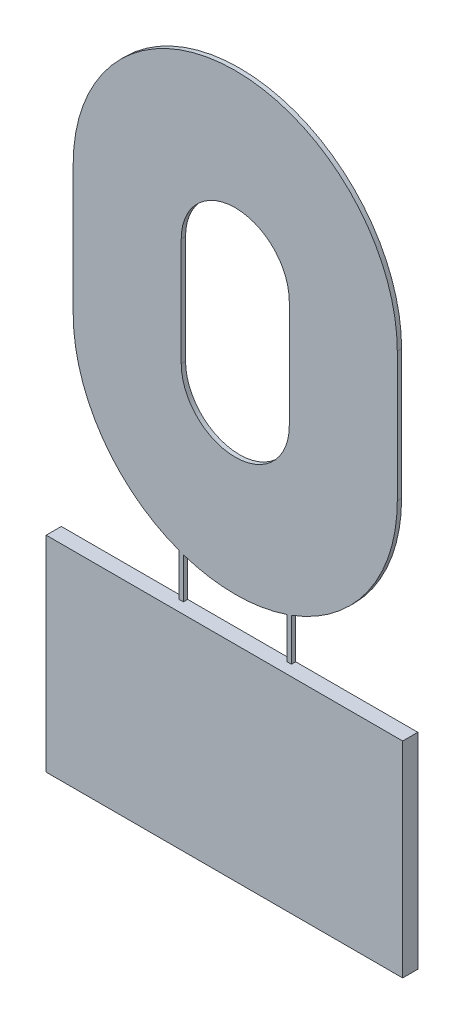
ISO-10303-21;
HEADER;
FILE_DESCRIPTION(('STEP AP214'),'2;1');
FILE_NAME('part.step','',(''),(''),'','','');
FILE_SCHEMA(('AUTOMOTIVE_DESIGN { 1 0 10303 214 1 1 1 1 }'));
ENDSEC;
DATA;
#1=APPLICATION_CONTEXT('core data for automotive mechanical design processes');
#2=APPLICATION_PROTOCOL_DEFINITION('international standard','automotive_design',2000,#1);
#3=PRODUCT_CONTEXT('',#1,'mechanical');
#4=PRODUCT('Part','Part','',(#3));
#5=PRODUCT_RELATED_PRODUCT_CATEGORY('part','',(#4));
#6=PRODUCT_DEFINITION_FORMATION('','',#4);
#7=PRODUCT_DEFINITION_CONTEXT('part definition',#1,'design');
#8=PRODUCT_DEFINITION('design','',#6,#7);
#9=PRODUCT_DEFINITION_SHAPE('','',#8);
#10=(LENGTH_UNIT() NAMED_UNIT(*) SI_UNIT(.MILLI.,.METRE.));
#11=(NAMED_UNIT(*) PLANE_ANGLE_UNIT() SI_UNIT($,.RADIAN.));
#12=(NAMED_UNIT(*) SI_UNIT($,.STERADIAN.) SOLID_ANGLE_UNIT());
#13=UNCERTAINTY_MEASURE_WITH_UNIT(LENGTH_MEASURE(1.E-05),#10,'distance_accuracy_value','');
#14=(GEOMETRIC_REPRESENTATION_CONTEXT(3) GLOBAL_UNCERTAINTY_ASSIGNED_CONTEXT((#13)) GLOBAL_UNIT_ASSIGNED_CONTEXT((#10,
#11,#12)) REPRESENTATION_CONTEXT('',''));
#15=CARTESIAN_POINT('',(0.,0.,0.));
#16=DIRECTION('',(0.,0.,1.));
#17=DIRECTION('',(1.,0.,0.));
#18=AXIS2_PLACEMENT_3D('',#15,#16,#17);
#19=CARTESIAN_POINT('',(0.,-6.,0.4));
#20=DIRECTION('',(0.,0.,-1.));
#21=DIRECTION('',(-1.,0.,0.));
#22=AXIS2_PLACEMENT_3D('',#19,#20,#21);
#23=CYLINDRICAL_SURFACE('',#22,15.);
#24=CARTESIAN_POINT('',(0.,-6.,0.4));
#25=DIRECTION('',(0.,0.,1.));
#26=DIRECTION('',(1.,0.,0.));
#27=AXIS2_PLACEMENT_3D('',#24,#25,#26);
#28=CIRCLE('',#27,15.);
#29=CARTESIAN_POINT('',(-4.79999999999998,-20.2112631387924,0.4));
#30=VERTEX_POINT('',#29);
#31=CARTESIAN_POINT('',(4.80000000000001,-20.2112631387924,0.4));
#32=VERTEX_POINT('',#31);
#33=EDGE_CURVE('E397',#30,#32,#28,.T.);
#34=ORIENTED_EDGE('',*,*,#33,.F.);
#35=DIRECTION('',(0.,0.,-1.));
#36=VECTOR('',#35,1.);
#37=CARTESIAN_POINT('',(-4.79999999999998,-20.2112631387924,0.4));
#38=LINE('',#37,#36);
#39=CARTESIAN_POINT('',(-4.79999999999998,-20.2112631387924,0.));
#40=VERTEX_POINT('',#39);
#41=EDGE_CURVE('E269',#30,#40,#38,.T.);
#42=ORIENTED_EDGE('',*,*,#41,.T.);
#43=CARTESIAN_POINT('',(0.,-6.,0.));
#44=DIRECTION('',(0.,0.,1.));
#45=DIRECTION('',(1.,0.,0.));
#46=AXIS2_PLACEMENT_3D('',#43,#44,#45);
#47=CIRCLE('',#46,15.);
#48=CARTESIAN_POINT('',(4.80000000000001,-20.2112631387924,0.));
#49=VERTEX_POINT('',#48);
#50=EDGE_CURVE('E408',#40,#49,#47,.T.);
#51=ORIENTED_EDGE('',*,*,#50,.T.);
#52=DIRECTION('',(0.,0.,-1.));
#53=VECTOR('',#52,1.);
#54=CARTESIAN_POINT('',(4.80000000000001,-20.2112631387924,0.4));
#55=LINE('',#54,#53);
#56=EDGE_CURVE('E421',#49,#32,#55,.F.);
#57=ORIENTED_EDGE('',*,*,#56,.T.);
#58=EDGE_LOOP('',(#34,#42,#51,#57));
#59=FACE_BOUND('',#58,.T.);
#60=ADVANCED_FACE('F38',(#59),#23,.T.);
#61=CARTESIAN_POINT('',(0.,6.,0.4));
#62=DIRECTION('',(0.,0.,1.));
#63=DIRECTION('',(1.,0.,0.));
#64=AXIS2_PLACEMENT_3D('',#61,#62,#63);
#65=PLANE('',#64);
#66=CARTESIAN_POINT('',(-15.,-6.,0.4));
#67=VERTEX_POINT('',#66);
#68=CARTESIAN_POINT('',(-5.19999999999998,-20.0698258695693,0.4));
#69=VERTEX_POINT('',#68);
#70=EDGE_CURVE('E393',#67,#69,#28,.T.);
#71=ORIENTED_EDGE('',*,*,#70,.T.);
#72=DIRECTION('',(0.,-1.,0.));
#73=VECTOR('',#72,1.);
#74=CARTESIAN_POINT('',(-5.19999999999998,-18.2212359899984,0.4));
#75=LINE('',#74,#73);
#76=CARTESIAN_POINT('',(-5.19999999999998,-24.,0.4));
#77=VERTEX_POINT('',#76);
#78=EDGE_CURVE('E246',#69,#77,#75,.T.);
#79=ORIENTED_EDGE('',*,*,#78,.T.);
#80=DIRECTION('',(-1.,0.,0.));
#81=VECTOR('',#80,1.);
#82=CARTESIAN_POINT('',(-16.5,-24.,0.4));
#83=LINE('',#82,#81);
#84=CARTESIAN_POINT('',(-4.79999999999998,-24.,0.4));
#85=VERTEX_POINT('',#84);
#86=EDGE_CURVE('E46',#85,#77,#83,.T.);
#87=ORIENTED_EDGE('',*,*,#86,.F.);
#88=DIRECTION('',(0.,1.,0.));
#89=VECTOR('',#88,1.);
#90=CARTESIAN_POINT('',(-4.79999999999999,-18.2212359899984,0.4));
#91=LINE('',#90,#89);
#92=EDGE_CURVE('E53',#85,#30,#91,.T.);
#93=ORIENTED_EDGE('',*,*,#92,.T.);
#94=ORIENTED_EDGE('',*,*,#33,.T.);
#95=DIRECTION('',(0.,-1.,0.));
#96=VECTOR('',#95,1.);
#97=CARTESIAN_POINT('',(4.80000000000001,-18.2604078670592,0.4));
#98=LINE('',#97,#96);
#99=CARTESIAN_POINT('',(4.80000000000002,-24.,0.400000000000002));
#100=VERTEX_POINT('',#99);
#101=EDGE_CURVE('E320',#32,#100,#98,.T.);
#102=ORIENTED_EDGE('',*,*,#101,.T.);
#103=DIRECTION('',(1.,0.,0.));
#104=VECTOR('',#103,1.);
#105=CARTESIAN_POINT('',(0.,-24.,0.4));
#106=LINE('',#105,#104);
#107=CARTESIAN_POINT('',(5.20000000000002,-24.,0.4));
#108=VERTEX_POINT('',#107);
#109=EDGE_CURVE('E313',#100,#108,#106,.T.);
#110=ORIENTED_EDGE('',*,*,#109,.T.);
#111=DIRECTION('',(0.,1.,0.));
#112=VECTOR('',#111,1.);
#113=CARTESIAN_POINT('',(5.20000000000002,-18.2604078670592,0.4));
#114=LINE('',#113,#112);
#115=CARTESIAN_POINT('',(5.20000000000002,-20.0698258695693,0.4));
#116=VERTEX_POINT('',#115);
#117=EDGE_CURVE('E319',#108,#116,#114,.T.);
#118=ORIENTED_EDGE('',*,*,#117,.T.);
#119=CARTESIAN_POINT('',(15.,-6.,0.4));
#120=VERTEX_POINT('',#119);
#121=EDGE_CURVE('E392',#116,#120,#28,.T.);
#122=ORIENTED_EDGE('',*,*,#121,.T.);
#123=DIRECTION('',(0.,1.,0.));
#124=VECTOR('',#123,1.);
#125=CARTESIAN_POINT('',(15.,6.,0.4));
#126=LINE('',#125,#124);
#127=CARTESIAN_POINT('',(15.,6.,0.4));
#128=VERTEX_POINT('',#127);
#129=EDGE_CURVE('E396',#120,#128,#126,.T.);
#130=ORIENTED_EDGE('',*,*,#129,.T.);
#131=CARTESIAN_POINT('',(0.,6.,0.4));
#132=DIRECTION('',(0.,0.,1.));
#133=DIRECTION('',(1.,0.,0.));
#134=AXIS2_PLACEMENT_3D('',#131,#132,#133);
#135=CIRCLE('',#134,15.);
#136=CARTESIAN_POINT('',(-15.,6.,0.4));
#137=VERTEX_POINT('',#136);
#138=EDGE_CURVE('E386',#128,#137,#135,.T.);
#139=ORIENTED_EDGE('',*,*,#138,.T.);
#140=DIRECTION('',(0.,-1.,0.));
#141=VECTOR('',#140,1.);
#142=CARTESIAN_POINT('',(-15.,6.,0.4));
#143=LINE('',#142,#141);
#144=EDGE_CURVE('E389',#137,#67,#143,.T.);
#145=ORIENTED_EDGE('',*,*,#144,.T.);
#146=EDGE_LOOP('',(#71,#79,#87,#93,#94,#102,#110,#118,#122,#130,#139,#145));
#147=FACE_BOUND('',#146,.T.);
#148=DIRECTION('',(0.,-1.,0.));
#149=VECTOR('',#148,1.);
#150=CARTESIAN_POINT('',(-5.,5.,0.4));
#151=LINE('',#150,#149);
#152=CARTESIAN_POINT('',(-5.,5.,0.4));
#153=VERTEX_POINT('',#152);
#154=CARTESIAN_POINT('',(-5.,-5.,0.4));
#155=VERTEX_POINT('',#154);
#156=EDGE_CURVE('E357',#153,#155,#151,.T.);
#157=ORIENTED_EDGE('',*,*,#156,.F.);
#158=CARTESIAN_POINT('',(0.,5.,0.4));
#159=DIRECTION('',(0.,0.,1.));
#160=DIRECTION('',(1.,0.,0.));
#161=AXIS2_PLACEMENT_3D('',#158,#159,#160);
#162=CIRCLE('',#161,5.);
#163=CARTESIAN_POINT('',(5.,5.,0.4));
#164=VERTEX_POINT('',#163);
#165=EDGE_CURVE('E355',#164,#153,#162,.T.);
#166=ORIENTED_EDGE('',*,*,#165,.F.);
#167=DIRECTION('',(0.,1.,0.));
#168=VECTOR('',#167,1.);
#169=CARTESIAN_POINT('',(5.,5.,0.4));
#170=LINE('',#169,#168);
#171=CARTESIAN_POINT('',(5.,-5.,0.4));
#172=VERTEX_POINT('',#171);
#173=EDGE_CURVE('E363',#172,#164,#170,.T.);
#174=ORIENTED_EDGE('',*,*,#173,.F.);
#175=CARTESIAN_POINT('',(0.,-5.,0.4));
#176=DIRECTION('',(0.,0.,1.));
#177=DIRECTION('',(1.,0.,0.));
#178=AXIS2_PLACEMENT_3D('',#175,#176,#177);
#179=CIRCLE('',#178,5.);
#180=EDGE_CURVE('E360',#155,#172,#179,.T.);
#181=ORIENTED_EDGE('',*,*,#180,.F.);
#182=EDGE_LOOP('',(#157,#166,#174,#181));
#183=FACE_BOUND('',#182,.T.);
#184=ADVANCED_FACE('F449',(#147,#183),#65,.T.);
#185=CARTESIAN_POINT('',(5.20000000000002,-18.2604078670592,-0.001));
#186=DIRECTION('',(1.,0.,0.));
#187=DIRECTION('',(0.,0.,-1.));
#188=AXIS2_PLACEMENT_3D('',#185,#186,#187);
#189=PLANE('',#188);
#190=ORIENTED_EDGE('',*,*,#117,.F.);
#191=DIRECTION('',(0.,0.,-1.));
#192=VECTOR('',#191,1.);
#193=CARTESIAN_POINT('',(5.20000000000002,-24.,-0.001));
#194=LINE('',#193,#192);
#195=CARTESIAN_POINT('',(5.20000000000002,-24.,0.));
#196=VERTEX_POINT('',#195);
#197=EDGE_CURVE('E316',#108,#196,#194,.T.);
#198=ORIENTED_EDGE('',*,*,#197,.T.);
#199=DIRECTION('',(0.,-1.,0.));
#200=VECTOR('',#199,1.);
#201=CARTESIAN_POINT('',(5.20000000000002,-18.2604078670592,0.));
#202=LINE('',#201,#200);
#203=CARTESIAN_POINT('',(5.20000000000002,-24.2604078670592,0.));
#204=VERTEX_POINT('',#203);
#205=EDGE_CURVE('E310',#196,#204,#202,.T.);
#206=ORIENTED_EDGE('',*,*,#205,.T.);
#207=DIRECTION('',(0.,0.,1.));
#208=VECTOR('',#207,1.);
#209=CARTESIAN_POINT('',(5.20000000000002,-24.2604078670592,-0.001));
#210=LINE('',#209,#208);
#211=CARTESIAN_POINT('',(5.20000000000002,-24.2604078670592,-0.001));
#212=VERTEX_POINT('',#211);
#213=EDGE_CURVE('E337',#212,#204,#210,.T.);
#214=ORIENTED_EDGE('',*,*,#213,.F.);
#215=DIRECTION('',(0.,1.,0.));
#216=VECTOR('',#215,1.);
#217=CARTESIAN_POINT('',(5.20000000000002,-18.2604078670592,-0.001));
#218=LINE('',#217,#216);
#219=CARTESIAN_POINT('',(5.20000000000002,-18.2604078670592,-0.001));
#220=VERTEX_POINT('',#219);
#221=EDGE_CURVE('E323',#212,#220,#218,.T.);
#222=ORIENTED_EDGE('',*,*,#221,.T.);
#223=DIRECTION('',(0.,0.,1.));
#224=VECTOR('',#223,1.);
#225=CARTESIAN_POINT('',(5.20000000000002,-18.2604078670592,-0.001));
#226=LINE('',#225,#224);
#227=CARTESIAN_POINT('',(5.20000000000002,-18.2604078670592,0.));
#228=VERTEX_POINT('',#227);
#229=EDGE_CURVE('E336',#220,#228,#226,.T.);
#230=ORIENTED_EDGE('',*,*,#229,.T.);
#231=DIRECTION('',(0.,1.,0.));
#232=VECTOR('',#231,1.);
#233=CARTESIAN_POINT('',(5.20000000000002,6.,0.));
#234=LINE('',#233,#232);
#235=CARTESIAN_POINT('',(5.20000000000002,-20.0698258695693,0.));
#236=VERTEX_POINT('',#235);
#237=EDGE_CURVE('E351',#236,#228,#234,.T.);
#238=ORIENTED_EDGE('',*,*,#237,.F.);
#239=DIRECTION('',(0.,0.,-1.));
#240=VECTOR('',#239,1.);
#241=CARTESIAN_POINT('',(5.20000000000002,-20.0698258695693,0.4));
#242=LINE('',#241,#240);
#243=EDGE_CURVE('E424',#116,#236,#242,.T.);
#244=ORIENTED_EDGE('',*,*,#243,.F.);
#245=EDGE_LOOP('',(#190,#198,#206,#214,#222,#230,#238,#244));
#246=FACE_BOUND('',#245,.T.);
#247=ADVANCED_FACE('F486',(#246),#189,.T.);
#248=CARTESIAN_POINT('',(4.80000000000001,-18.2604078670592,-0.001));
#249=DIRECTION('',(-1.,0.,0.));
#250=DIRECTION('',(0.,-1.,0.));
#251=AXIS2_PLACEMENT_3D('',#248,#249,#250);
#252=PLANE('',#251);
#253=DIRECTION('',(0.,1.,0.));
#254=VECTOR('',#253,1.);
#255=CARTESIAN_POINT('',(4.80000000000001,-18.2604078670592,0.));
#256=LINE('',#255,#254);
#257=CARTESIAN_POINT('',(4.80000000000002,-24.2604078670592,0.));
#258=VERTEX_POINT('',#257);
#259=CARTESIAN_POINT('',(4.80000000000002,-24.,0.));
#260=VERTEX_POINT('',#259);
#261=EDGE_CURVE('E307',#258,#260,#256,.T.);
#262=ORIENTED_EDGE('',*,*,#261,.T.);
#263=DIRECTION('',(0.,0.,1.));
#264=VECTOR('',#263,1.);
#265=CARTESIAN_POINT('',(4.80000000000002,-24.,-0.001));
#266=LINE('',#265,#264);
#267=EDGE_CURVE('E433',#260,#100,#266,.T.);
#268=ORIENTED_EDGE('',*,*,#267,.T.);
#269=ORIENTED_EDGE('',*,*,#101,.F.);
#270=ORIENTED_EDGE('',*,*,#56,.F.);
#271=DIRECTION('',(0.,-1.,0.));
#272=VECTOR('',#271,1.);
#273=CARTESIAN_POINT('',(4.80000000000001,6.,0.));
#274=LINE('',#273,#272);
#275=CARTESIAN_POINT('',(4.80000000000001,-18.2604078670592,0.));
#276=VERTEX_POINT('',#275);
#277=EDGE_CURVE('E340',#276,#49,#274,.T.);
#278=ORIENTED_EDGE('',*,*,#277,.F.);
#279=DIRECTION('',(0.,0.,1.));
#280=VECTOR('',#279,1.);
#281=CARTESIAN_POINT('',(4.80000000000001,-18.2604078670592,-0.001));
#282=LINE('',#281,#280);
#283=CARTESIAN_POINT('',(4.80000000000001,-18.2604078670592,-0.001));
#284=VERTEX_POINT('',#283);
#285=EDGE_CURVE('E344',#284,#276,#282,.T.);
#286=ORIENTED_EDGE('',*,*,#285,.F.);
#287=DIRECTION('',(0.,-1.,0.));
#288=VECTOR('',#287,1.);
#289=CARTESIAN_POINT('',(4.80000000000001,-18.2604078670592,-0.001));
#290=LINE('',#289,#288);
#291=CARTESIAN_POINT('',(4.80000000000002,-24.2604078670592,-0.001));
#292=VERTEX_POINT('',#291);
#293=EDGE_CURVE('E330',#284,#292,#290,.T.);
#294=ORIENTED_EDGE('',*,*,#293,.T.);
#295=DIRECTION('',(0.,0.,1.));
#296=VECTOR('',#295,1.);
#297=CARTESIAN_POINT('',(4.80000000000002,-24.2604078670592,-0.001));
#298=LINE('',#297,#296);
#299=EDGE_CURVE('E341',#292,#258,#298,.T.);
#300=ORIENTED_EDGE('',*,*,#299,.T.);
#301=EDGE_LOOP('',(#262,#268,#269,#270,#278,#286,#294,#300));
#302=FACE_BOUND('',#301,.T.);
#303=ADVANCED_FACE('F484',(#302),#252,.T.);
#304=CARTESIAN_POINT('',(4.80000000000002,-24.2604078670592,-0.001));
#305=DIRECTION('',(0.,-1.,0.));
#306=DIRECTION('',(0.,0.,-1.));
#307=AXIS2_PLACEMENT_3D('',#304,#305,#306);
#308=PLANE('',#307);
#309=ORIENTED_EDGE('',*,*,#213,.T.);
#310=DIRECTION('',(-1.,0.,0.));
#311=VECTOR('',#310,1.);
#312=CARTESIAN_POINT('',(4.80000000000002,-24.2604078670592,0.));
#313=LINE('',#312,#311);
#314=EDGE_CURVE('E430',#204,#258,#313,.T.);
#315=ORIENTED_EDGE('',*,*,#314,.T.);
#316=ORIENTED_EDGE('',*,*,#299,.F.);
#317=DIRECTION('',(1.,0.,0.));
#318=VECTOR('',#317,1.);
#319=CARTESIAN_POINT('',(4.80000000000002,-24.2604078670592,-0.001));
#320=LINE('',#319,#318);
#321=EDGE_CURVE('E333',#292,#212,#320,.T.);
#322=ORIENTED_EDGE('',*,*,#321,.T.);
#323=EDGE_LOOP('',(#309,#315,#316,#322));
#324=FACE_BOUND('',#323,.T.);
#325=ADVANCED_FACE('F496',(#324),#308,.T.);
#326=ORIENTED_EDGE('',*,*,#121,.F.);
#327=ORIENTED_EDGE('',*,*,#243,.T.);
#328=CARTESIAN_POINT('',(15.,-6.,0.));
#329=VERTEX_POINT('',#328);
#330=EDGE_CURVE('E404',#236,#329,#47,.T.);
#331=ORIENTED_EDGE('',*,*,#330,.T.);
#332=DIRECTION('',(0.,0.,-1.));
#333=VECTOR('',#332,1.);
#334=CARTESIAN_POINT('',(15.,-6.,0.4));
#335=LINE('',#334,#333);
#336=EDGE_CURVE('E412',#120,#329,#335,.T.);
#337=ORIENTED_EDGE('',*,*,#336,.F.);
#338=EDGE_LOOP('',(#326,#327,#331,#337));
#339=FACE_BOUND('',#338,.T.);
#340=ADVANCED_FACE('F463',(#339),#23,.T.);
#341=CARTESIAN_POINT('',(0.,6.,0.));
#342=DIRECTION('',(0.,0.,1.));
#343=DIRECTION('',(1.,0.,0.));
#344=AXIS2_PLACEMENT_3D('',#341,#342,#343);
#345=PLANE('',#344);
#346=ORIENTED_EDGE('',*,*,#50,.F.);
#347=DIRECTION('',(0.,1.,0.));
#348=VECTOR('',#347,1.);
#349=CARTESIAN_POINT('',(-4.79999999999999,6.,0.));
#350=LINE('',#349,#348);
#351=CARTESIAN_POINT('',(-4.79999999999999,-18.2212359899984,0.));
#352=VERTEX_POINT('',#351);
#353=EDGE_CURVE('E272',#40,#352,#350,.T.);
#354=ORIENTED_EDGE('',*,*,#353,.T.);
#355=DIRECTION('',(-1.,0.,0.));
#356=VECTOR('',#355,1.);
#357=CARTESIAN_POINT('',(0.,-18.2212359899984,0.));
#358=LINE('',#357,#356);
#359=CARTESIAN_POINT('',(-5.19999999999998,-18.2212359899984,0.));
#360=VERTEX_POINT('',#359);
#361=EDGE_CURVE('E11',#352,#360,#358,.T.);
#362=ORIENTED_EDGE('',*,*,#361,.T.);
#363=DIRECTION('',(0.,-1.,0.));
#364=VECTOR('',#363,1.);
#365=CARTESIAN_POINT('',(-5.19999999999998,6.,0.));
#366=LINE('',#365,#364);
#367=CARTESIAN_POINT('',(-5.19999999999998,-20.0698258695693,0.));
#368=VERTEX_POINT('',#367);
#369=EDGE_CURVE('E263',#360,#368,#366,.T.);
#370=ORIENTED_EDGE('',*,*,#369,.T.);
#371=CARTESIAN_POINT('',(-15.,-6.,0.));
#372=VERTEX_POINT('',#371);
#373=EDGE_CURVE('E405',#372,#368,#47,.T.);
#374=ORIENTED_EDGE('',*,*,#373,.F.);
#375=DIRECTION('',(0.,-1.,0.));
#376=VECTOR('',#375,1.);
#377=CARTESIAN_POINT('',(-15.,6.,0.));
#378=LINE('',#377,#376);
#379=CARTESIAN_POINT('',(-15.,6.,0.));
#380=VERTEX_POINT('',#379);
#381=EDGE_CURVE('E402',#380,#372,#378,.T.);
#382=ORIENTED_EDGE('',*,*,#381,.F.);
#383=CARTESIAN_POINT('',(0.,6.,0.));
#384=DIRECTION('',(0.,0.,1.));
#385=DIRECTION('',(1.,0.,0.));
#386=AXIS2_PLACEMENT_3D('',#383,#384,#385);
#387=CIRCLE('',#386,15.);
#388=CARTESIAN_POINT('',(15.,6.,0.));
#389=VERTEX_POINT('',#388);
#390=EDGE_CURVE('E385',#389,#380,#387,.T.);
#391=ORIENTED_EDGE('',*,*,#390,.F.);
#392=DIRECTION('',(0.,1.,0.));
#393=VECTOR('',#392,1.);
#394=CARTESIAN_POINT('',(15.,6.,0.));
#395=LINE('',#394,#393);
#396=EDGE_CURVE('E390',#329,#389,#395,.T.);
#397=ORIENTED_EDGE('',*,*,#396,.F.);
#398=ORIENTED_EDGE('',*,*,#330,.F.);
#399=ORIENTED_EDGE('',*,*,#237,.T.);
#400=DIRECTION('',(-1.,0.,0.));
#401=VECTOR('',#400,1.);
#402=CARTESIAN_POINT('',(0.,-18.2604078670592,0.));
#403=LINE('',#402,#401);
#404=EDGE_CURVE('E427',#228,#276,#403,.T.);
#405=ORIENTED_EDGE('',*,*,#404,.T.);
#406=ORIENTED_EDGE('',*,*,#277,.T.);
#407=EDGE_LOOP('',(#346,#354,#362,#370,#374,#382,#391,#397,#398,#399,#405,#406));
#408=FACE_BOUND('',#407,.T.);
#409=CARTESIAN_POINT('',(0.,5.,0.));
#410=DIRECTION('',(0.,0.,1.));
#411=DIRECTION('',(1.,0.,0.));
#412=AXIS2_PLACEMENT_3D('',#409,#410,#411);
#413=CIRCLE('',#412,5.);
#414=CARTESIAN_POINT('',(5.,5.,0.));
#415=VERTEX_POINT('',#414);
#416=CARTESIAN_POINT('',(-5.,5.,0.));
#417=VERTEX_POINT('',#416);
#418=EDGE_CURVE('E354',#415,#417,#413,.T.);
#419=ORIENTED_EDGE('',*,*,#418,.T.);
#420=DIRECTION('',(0.,-1.,0.));
#421=VECTOR('',#420,1.);
#422=CARTESIAN_POINT('',(-5.,5.,0.));
#423=LINE('',#422,#421);
#424=CARTESIAN_POINT('',(-5.,-5.,0.));
#425=VERTEX_POINT('',#424);
#426=EDGE_CURVE('E368',#417,#425,#423,.T.);
#427=ORIENTED_EDGE('',*,*,#426,.T.);
#428=CARTESIAN_POINT('',(0.,-5.,0.));
#429=DIRECTION('',(0.,0.,1.));
#430=DIRECTION('',(1.,0.,0.));
#431=AXIS2_PLACEMENT_3D('',#428,#429,#430);
#432=CIRCLE('',#431,5.);
#433=CARTESIAN_POINT('',(5.,-5.,0.));
#434=VERTEX_POINT('',#433);
#435=EDGE_CURVE('E371',#425,#434,#432,.T.);
#436=ORIENTED_EDGE('',*,*,#435,.T.);
#437=DIRECTION('',(0.,1.,0.));
#438=VECTOR('',#437,1.);
#439=CARTESIAN_POINT('',(5.,5.,0.));
#440=LINE('',#439,#438);
#441=EDGE_CURVE('E358',#434,#415,#440,.T.);
#442=ORIENTED_EDGE('',*,*,#441,.T.);
#443=EDGE_LOOP('',(#419,#427,#436,#442));
#444=FACE_BOUND('',#443,.T.);
#445=ADVANCED_FACE('F481',(#408,#444),#345,.F.);
#446=CARTESIAN_POINT('',(0.,6.,0.4));
#447=DIRECTION('',(0.,0.,-1.));
#448=DIRECTION('',(-1.,0.,0.));
#449=AXIS2_PLACEMENT_3D('',#446,#447,#448);
#450=CYLINDRICAL_SURFACE('',#449,15.);
#451=ORIENTED_EDGE('',*,*,#390,.T.);
#452=DIRECTION('',(0.,0.,-1.));
#453=VECTOR('',#452,1.);
#454=CARTESIAN_POINT('',(-15.,6.,0.4));
#455=LINE('',#454,#453);
#456=EDGE_CURVE('E418',#137,#380,#455,.T.);
#457=ORIENTED_EDGE('',*,*,#456,.F.);
#458=ORIENTED_EDGE('',*,*,#138,.F.);
#459=DIRECTION('',(0.,0.,-1.));
#460=VECTOR('',#459,1.);
#461=CARTESIAN_POINT('',(15.,6.,0.4));
#462=LINE('',#461,#460);
#463=EDGE_CURVE('E399',#128,#389,#462,.T.);
#464=ORIENTED_EDGE('',*,*,#463,.T.);
#465=EDGE_LOOP('',(#451,#457,#458,#464));
#466=FACE_BOUND('',#465,.T.);
#467=ADVANCED_FACE('F40',(#466),#450,.T.);
#468=CARTESIAN_POINT('',(-15.,6.,0.4));
#469=DIRECTION('',(1.,0.,0.));
#470=DIRECTION('',(0.,0.,-1.));
#471=AXIS2_PLACEMENT_3D('',#468,#469,#470);
#472=PLANE('',#471);
#473=ORIENTED_EDGE('',*,*,#381,.T.);
#474=DIRECTION('',(0.,0.,-1.));
#475=VECTOR('',#474,1.);
#476=CARTESIAN_POINT('',(-15.,-6.,0.4));
#477=LINE('',#476,#475);
#478=EDGE_CURVE('E415',#67,#372,#477,.T.);
#479=ORIENTED_EDGE('',*,*,#478,.F.);
#480=ORIENTED_EDGE('',*,*,#144,.F.);
#481=ORIENTED_EDGE('',*,*,#456,.T.);
#482=EDGE_LOOP('',(#473,#479,#480,#481));
#483=FACE_BOUND('',#482,.T.);
#484=ADVANCED_FACE('F475',(#483),#472,.F.);
#485=ORIENTED_EDGE('',*,*,#373,.T.);
#486=DIRECTION('',(0.,0.,-1.));
#487=VECTOR('',#486,1.);
#488=CARTESIAN_POINT('',(-5.19999999999998,-20.0698258695693,0.4));
#489=LINE('',#488,#487);
#490=EDGE_CURVE('E260',#368,#69,#489,.F.);
#491=ORIENTED_EDGE('',*,*,#490,.T.);
#492=ORIENTED_EDGE('',*,*,#70,.F.);
#493=ORIENTED_EDGE('',*,*,#478,.T.);
#494=EDGE_LOOP('',(#485,#491,#492,#493));
#495=FACE_BOUND('',#494,.T.);
#496=ADVANCED_FACE('F478',(#495),#23,.T.);
#497=CARTESIAN_POINT('',(15.,6.,0.4));
#498=DIRECTION('',(-1.,0.,0.));
#499=DIRECTION('',(0.,0.,1.));
#500=AXIS2_PLACEMENT_3D('',#497,#498,#499);
#501=PLANE('',#500);
#502=ORIENTED_EDGE('',*,*,#396,.T.);
#503=ORIENTED_EDGE('',*,*,#463,.F.);
#504=ORIENTED_EDGE('',*,*,#129,.F.);
#505=ORIENTED_EDGE('',*,*,#336,.T.);
#506=EDGE_LOOP('',(#502,#503,#504,#505));
#507=FACE_BOUND('',#506,.T.);
#508=ADVANCED_FACE('F467',(#507),#501,.F.);
#509=CARTESIAN_POINT('',(0.,5.,0.4));
#510=DIRECTION('',(0.,0.,-1.));
#511=DIRECTION('',(-1.,0.,0.));
#512=AXIS2_PLACEMENT_3D('',#509,#510,#511);
#513=CYLINDRICAL_SURFACE('',#512,5.);
#514=ORIENTED_EDGE('',*,*,#418,.F.);
#515=DIRECTION('',(0.,0.,-1.));
#516=VECTOR('',#515,1.);
#517=CARTESIAN_POINT('',(5.,5.,0.4));
#518=LINE('',#517,#516);
#519=EDGE_CURVE('E365',#164,#415,#518,.T.);
#520=ORIENTED_EDGE('',*,*,#519,.F.);
#521=ORIENTED_EDGE('',*,*,#165,.T.);
#522=DIRECTION('',(0.,0.,-1.));
#523=VECTOR('',#522,1.);
#524=CARTESIAN_POINT('',(-5.,5.,0.4));
#525=LINE('',#524,#523);
#526=EDGE_CURVE('E382',#153,#417,#525,.T.);
#527=ORIENTED_EDGE('',*,*,#526,.T.);
#528=EDGE_LOOP('',(#514,#520,#521,#527));
#529=FACE_BOUND('',#528,.T.);
#530=ADVANCED_FACE('F540',(#529),#513,.F.);
#531=CARTESIAN_POINT('',(-5.,5.,0.4));
#532=DIRECTION('',(1.,0.,0.));
#533=DIRECTION('',(0.,1.,0.));
#534=AXIS2_PLACEMENT_3D('',#531,#532,#533);
#535=PLANE('',#534);
#536=ORIENTED_EDGE('',*,*,#426,.F.);
#537=ORIENTED_EDGE('',*,*,#526,.F.);
#538=ORIENTED_EDGE('',*,*,#156,.T.);
#539=DIRECTION('',(0.,0.,-1.));
#540=VECTOR('',#539,1.);
#541=CARTESIAN_POINT('',(-5.,-5.,0.4));
#542=LINE('',#541,#540);
#543=EDGE_CURVE('E380',#155,#425,#542,.T.);
#544=ORIENTED_EDGE('',*,*,#543,.T.);
#545=EDGE_LOOP('',(#536,#537,#538,#544));
#546=FACE_BOUND('',#545,.T.);
#547=ADVANCED_FACE('F553',(#546),#535,.T.);
#548=CARTESIAN_POINT('',(0.,-5.,0.4));
#549=DIRECTION('',(0.,0.,-1.));
#550=DIRECTION('',(-1.,0.,0.));
#551=AXIS2_PLACEMENT_3D('',#548,#549,#550);
#552=CYLINDRICAL_SURFACE('',#551,5.);
#553=ORIENTED_EDGE('',*,*,#435,.F.);
#554=ORIENTED_EDGE('',*,*,#543,.F.);
#555=ORIENTED_EDGE('',*,*,#180,.T.);
#556=DIRECTION('',(0.,0.,-1.));
#557=VECTOR('',#556,1.);
#558=CARTESIAN_POINT('',(5.,-5.,0.4));
#559=LINE('',#558,#557);
#560=EDGE_CURVE('E378',#172,#434,#559,.T.);
#561=ORIENTED_EDGE('',*,*,#560,.T.);
#562=EDGE_LOOP('',(#553,#554,#555,#561));
#563=FACE_BOUND('',#562,.T.);
#564=ADVANCED_FACE('F557',(#563),#552,.F.);
#565=CARTESIAN_POINT('',(5.,5.,0.4));
#566=DIRECTION('',(-1.,0.,0.));
#567=DIRECTION('',(0.,-1.,0.));
#568=AXIS2_PLACEMENT_3D('',#565,#566,#567);
#569=PLANE('',#568);
#570=ORIENTED_EDGE('',*,*,#441,.F.);
#571=ORIENTED_EDGE('',*,*,#560,.F.);
#572=ORIENTED_EDGE('',*,*,#173,.T.);
#573=ORIENTED_EDGE('',*,*,#519,.T.);
#574=EDGE_LOOP('',(#570,#571,#572,#573));
#575=FACE_BOUND('',#574,.T.);
#576=ADVANCED_FACE('F561',(#575),#569,.T.);
#577=CARTESIAN_POINT('',(4.80000000000001,-18.2604078670592,-0.001));
#578=DIRECTION('',(0.,1.,0.));
#579=DIRECTION('',(0.,0.,1.));
#580=AXIS2_PLACEMENT_3D('',#577,#578,#579);
#581=PLANE('',#580);
#582=ORIENTED_EDGE('',*,*,#404,.F.);
#583=ORIENTED_EDGE('',*,*,#229,.F.);
#584=DIRECTION('',(-1.,0.,0.));
#585=VECTOR('',#584,1.);
#586=CARTESIAN_POINT('',(4.80000000000001,-18.2604078670592,-0.001));
#587=LINE('',#586,#585);
#588=EDGE_CURVE('E327',#220,#284,#587,.T.);
#589=ORIENTED_EDGE('',*,*,#588,.T.);
#590=ORIENTED_EDGE('',*,*,#285,.T.);
#591=EDGE_LOOP('',(#582,#583,#589,#590));
#592=FACE_BOUND('',#591,.T.);
#593=ADVANCED_FACE('F488',(#592),#581,.T.);
#594=CARTESIAN_POINT('',(0.,0.,-0.001));
#595=DIRECTION('',(0.,0.,1.));
#596=DIRECTION('',(1.,0.,0.));
#597=AXIS2_PLACEMENT_3D('',#594,#595,#596);
#598=PLANE('',#597);
#599=ORIENTED_EDGE('',*,*,#221,.F.);
#600=ORIENTED_EDGE('',*,*,#321,.F.);
#601=ORIENTED_EDGE('',*,*,#293,.F.);
#602=ORIENTED_EDGE('',*,*,#588,.F.);
#603=EDGE_LOOP('',(#599,#600,#601,#602));
#604=FACE_BOUND('',#603,.T.);
#605=ADVANCED_FACE('F493',(#604),#598,.F.);
#606=CARTESIAN_POINT('',(16.5,-24.,1.4));
#607=DIRECTION('',(-1.,0.,0.));
#608=DIRECTION('',(0.,0.,1.));
#609=AXIS2_PLACEMENT_3D('',#606,#607,#608);
#610=PLANE('',#609);
#611=DIRECTION('',(0.,1.,0.));
#612=VECTOR('',#611,1.);
#613=CARTESIAN_POINT('',(16.5,-24.,0.));
#614=LINE('',#613,#612);
#615=CARTESIAN_POINT('',(16.5,-43.,0.));
#616=VERTEX_POINT('',#615);
#617=CARTESIAN_POINT('',(16.5,-24.,0.));
#618=VERTEX_POINT('',#617);
#619=EDGE_CURVE('E274',#616,#618,#614,.T.);
#620=ORIENTED_EDGE('',*,*,#619,.T.);
#621=DIRECTION('',(0.,0.,-1.));
#622=VECTOR('',#621,1.);
#623=CARTESIAN_POINT('',(16.5,-24.,1.4));
#624=LINE('',#623,#622);
#625=CARTESIAN_POINT('',(16.5,-24.,1.4));
#626=VERTEX_POINT('',#625);
#627=EDGE_CURVE('E304',#626,#618,#624,.T.);
#628=ORIENTED_EDGE('',*,*,#627,.F.);
#629=DIRECTION('',(0.,1.,0.));
#630=VECTOR('',#629,1.);
#631=CARTESIAN_POINT('',(16.5,-24.,1.4));
#632=LINE('',#631,#630);
#633=CARTESIAN_POINT('',(16.5,-43.,1.4));
#634=VERTEX_POINT('',#633);
#635=EDGE_CURVE('E275',#634,#626,#632,.T.);
#636=ORIENTED_EDGE('',*,*,#635,.F.);
#637=DIRECTION('',(0.,0.,-1.));
#638=VECTOR('',#637,1.);
#639=CARTESIAN_POINT('',(16.5,-43.,1.4));
#640=LINE('',#639,#638);
#641=EDGE_CURVE('E285',#634,#616,#640,.T.);
#642=ORIENTED_EDGE('',*,*,#641,.T.);
#643=EDGE_LOOP('',(#620,#628,#636,#642));
#644=FACE_BOUND('',#643,.T.);
#645=ADVANCED_FACE('F514',(#644),#610,.F.);
#646=CARTESIAN_POINT('',(-16.5,-24.,1.4));
#647=DIRECTION('',(0.,-1.,0.));
#648=DIRECTION('',(0.,0.,-1.));
#649=AXIS2_PLACEMENT_3D('',#646,#647,#648);
#650=PLANE('',#649);
#651=DIRECTION('',(-1.,0.,0.));
#652=VECTOR('',#651,1.);
#653=CARTESIAN_POINT('',(-16.5,-24.,0.));
#654=LINE('',#653,#652);
#655=CARTESIAN_POINT('',(-4.79999999999998,-24.,0.));
#656=VERTEX_POINT('',#655);
#657=EDGE_CURVE('E293',#260,#656,#654,.T.);
#658=ORIENTED_EDGE('',*,*,#657,.T.);
#659=DIRECTION('',(0.,0.,1.));
#660=VECTOR('',#659,1.);
#661=CARTESIAN_POINT('',(-4.79999999999998,-24.,1.4));
#662=LINE('',#661,#660);
#663=EDGE_CURVE('E266',#656,#85,#662,.T.);
#664=ORIENTED_EDGE('',*,*,#663,.T.);
#665=ORIENTED_EDGE('',*,*,#86,.T.);
#666=DIRECTION('',(0.,0.,-1.));
#667=VECTOR('',#666,1.);
#668=CARTESIAN_POINT('',(-5.19999999999998,-24.,1.4));
#669=LINE('',#668,#667);
#670=CARTESIAN_POINT('',(-5.19999999999998,-24.,0.));
#671=VERTEX_POINT('',#670);
#672=EDGE_CURVE('E255',#77,#671,#669,.T.);
#673=ORIENTED_EDGE('',*,*,#672,.T.);
#674=CARTESIAN_POINT('',(-16.5,-24.,0.));
#675=VERTEX_POINT('',#674);
#676=EDGE_CURVE('E288',#671,#675,#654,.T.);
#677=ORIENTED_EDGE('',*,*,#676,.T.);
#678=DIRECTION('',(0.,0.,-1.));
#679=VECTOR('',#678,1.);
#680=CARTESIAN_POINT('',(-16.5,-24.,1.4));
#681=LINE('',#680,#679);
#682=CARTESIAN_POINT('',(-16.5,-24.,1.4));
#683=VERTEX_POINT('',#682);
#684=EDGE_CURVE('E301',#683,#675,#681,.T.);
#685=ORIENTED_EDGE('',*,*,#684,.F.);
#686=DIRECTION('',(-1.,0.,0.));
#687=VECTOR('',#686,1.);
#688=CARTESIAN_POINT('',(-16.5,-24.,1.4));
#689=LINE('',#688,#687);
#690=EDGE_CURVE('E278',#626,#683,#689,.T.);
#691=ORIENTED_EDGE('',*,*,#690,.F.);
#692=ORIENTED_EDGE('',*,*,#627,.T.);
#693=EDGE_CURVE('E289',#618,#196,#654,.T.);
#694=ORIENTED_EDGE('',*,*,#693,.T.);
#695=ORIENTED_EDGE('',*,*,#197,.F.);
#696=ORIENTED_EDGE('',*,*,#109,.F.);
#697=ORIENTED_EDGE('',*,*,#267,.F.);
#698=EDGE_LOOP('',(#658,#664,#665,#673,#677,#685,#691,#692,#694,#695,#696,#697));
#699=FACE_BOUND('',#698,.T.);
#700=ADVANCED_FACE('F447',(#699),#650,.F.);
#701=CARTESIAN_POINT('',(-16.5,-24.,1.4));
#702=DIRECTION('',(1.,0.,0.));
#703=DIRECTION('',(0.,1.,0.));
#704=AXIS2_PLACEMENT_3D('',#701,#702,#703);
#705=PLANE('',#704);
#706=DIRECTION('',(0.,-1.,0.));
#707=VECTOR('',#706,1.);
#708=CARTESIAN_POINT('',(-16.5,-24.,0.));
#709=LINE('',#708,#707);
#710=CARTESIAN_POINT('',(-16.5,-43.,0.));
#711=VERTEX_POINT('',#710);
#712=EDGE_CURVE('E292',#675,#711,#709,.T.);
#713=ORIENTED_EDGE('',*,*,#712,.T.);
#714=DIRECTION('',(0.,0.,-1.));
#715=VECTOR('',#714,1.);
#716=CARTESIAN_POINT('',(-16.5,-43.,1.4));
#717=LINE('',#716,#715);
#718=CARTESIAN_POINT('',(-16.5,-43.,1.4));
#719=VERTEX_POINT('',#718);
#720=EDGE_CURVE('E298',#719,#711,#717,.T.);
#721=ORIENTED_EDGE('',*,*,#720,.F.);
#722=DIRECTION('',(0.,-1.,0.));
#723=VECTOR('',#722,1.);
#724=CARTESIAN_POINT('',(-16.5,-24.,1.4));
#725=LINE('',#724,#723);
#726=EDGE_CURVE('E281',#683,#719,#725,.T.);
#727=ORIENTED_EDGE('',*,*,#726,.F.);
#728=ORIENTED_EDGE('',*,*,#684,.T.);
#729=EDGE_LOOP('',(#713,#721,#727,#728));
#730=FACE_BOUND('',#729,.T.);
#731=ADVANCED_FACE('F504',(#730),#705,.F.);
#732=CARTESIAN_POINT('',(-16.5,-43.,1.4));
#733=DIRECTION('',(0.,1.,0.));
#734=DIRECTION('',(0.,0.,1.));
#735=AXIS2_PLACEMENT_3D('',#732,#733,#734);
#736=PLANE('',#735);
#737=DIRECTION('',(1.,0.,0.));
#738=VECTOR('',#737,1.);
#739=CARTESIAN_POINT('',(-16.5,-43.,0.));
#740=LINE('',#739,#738);
#741=EDGE_CURVE('E279',#711,#616,#740,.T.);
#742=ORIENTED_EDGE('',*,*,#741,.T.);
#743=ORIENTED_EDGE('',*,*,#641,.F.);
#744=DIRECTION('',(1.,0.,0.));
#745=VECTOR('',#744,1.);
#746=CARTESIAN_POINT('',(-16.5,-43.,1.4));
#747=LINE('',#746,#745);
#748=EDGE_CURVE('E283',#719,#634,#747,.T.);
#749=ORIENTED_EDGE('',*,*,#748,.F.);
#750=ORIENTED_EDGE('',*,*,#720,.T.);
#751=EDGE_LOOP('',(#742,#743,#749,#750));
#752=FACE_BOUND('',#751,.T.);
#753=ADVANCED_FACE('F510',(#752),#736,.F.);
#754=CARTESIAN_POINT('',(0.,0.,1.4));
#755=DIRECTION('',(0.,0.,1.));
#756=DIRECTION('',(1.,0.,0.));
#757=AXIS2_PLACEMENT_3D('',#754,#755,#756);
#758=PLANE('',#757);
#759=ORIENTED_EDGE('',*,*,#635,.T.);
#760=ORIENTED_EDGE('',*,*,#690,.T.);
#761=ORIENTED_EDGE('',*,*,#726,.T.);
#762=ORIENTED_EDGE('',*,*,#748,.T.);
#763=EDGE_LOOP('',(#759,#760,#761,#762));
#764=FACE_BOUND('',#763,.T.);
#765=ADVANCED_FACE('F517',(#764),#758,.T.);
#766=CARTESIAN_POINT('',(0.,0.,0.));
#767=DIRECTION('',(0.,0.,1.));
#768=DIRECTION('',(1.,0.,0.));
#769=AXIS2_PLACEMENT_3D('',#766,#767,#768);
#770=PLANE('',#769);
#771=DIRECTION('',(1.,0.,0.));
#772=VECTOR('',#771,1.);
#773=CARTESIAN_POINT('',(0.,-24.2212359899984,0.));
#774=LINE('',#773,#772);
#775=CARTESIAN_POINT('',(-5.19999999999998,-24.2212359899984,0.));
#776=VERTEX_POINT('',#775);
#777=CARTESIAN_POINT('',(-4.79999999999998,-24.2212359899984,0.));
#778=VERTEX_POINT('',#777);
#779=EDGE_CURVE('E439',#776,#778,#774,.T.);
#780=ORIENTED_EDGE('',*,*,#779,.T.);
#781=DIRECTION('',(0.,1.,0.));
#782=VECTOR('',#781,1.);
#783=CARTESIAN_POINT('',(-4.79999999999999,0.,0.));
#784=LINE('',#783,#782);
#785=EDGE_CURVE('E442',#778,#656,#784,.T.);
#786=ORIENTED_EDGE('',*,*,#785,.T.);
#787=ORIENTED_EDGE('',*,*,#657,.F.);
#788=ORIENTED_EDGE('',*,*,#261,.F.);
#789=ORIENTED_EDGE('',*,*,#314,.F.);
#790=ORIENTED_EDGE('',*,*,#205,.F.);
#791=ORIENTED_EDGE('',*,*,#693,.F.);
#792=ORIENTED_EDGE('',*,*,#619,.F.);
#793=ORIENTED_EDGE('',*,*,#741,.F.);
#794=ORIENTED_EDGE('',*,*,#712,.F.);
#795=ORIENTED_EDGE('',*,*,#676,.F.);
#796=DIRECTION('',(0.,-1.,0.));
#797=VECTOR('',#796,1.);
#798=CARTESIAN_POINT('',(-5.19999999999998,0.,0.));
#799=LINE('',#798,#797);
#800=EDGE_CURVE('E436',#671,#776,#799,.T.);
#801=ORIENTED_EDGE('',*,*,#800,.T.);
#802=EDGE_LOOP('',(#780,#786,#787,#788,#789,#790,#791,#792,#793,#794,#795,#801));
#803=FACE_BOUND('',#802,.T.);
#804=ADVANCED_FACE('F499',(#803),#770,.F.);
#805=CARTESIAN_POINT('',(-5.19999999999998,-18.2212359899984,-0.001));
#806=DIRECTION('',(0.,1.,0.));
#807=DIRECTION('',(0.,0.,1.));
#808=AXIS2_PLACEMENT_3D('',#805,#806,#807);
#809=PLANE('',#808);
#810=ORIENTED_EDGE('',*,*,#361,.F.);
#811=DIRECTION('',(0.,0.,1.));
#812=VECTOR('',#811,1.);
#813=CARTESIAN_POINT('',(-4.79999999999999,-18.2212359899984,-0.001));
#814=LINE('',#813,#812);
#815=CARTESIAN_POINT('',(-4.79999999999999,-18.2212359899984,-0.001));
#816=VERTEX_POINT('',#815);
#817=EDGE_CURVE('E223',#816,#352,#814,.T.);
#818=ORIENTED_EDGE('',*,*,#817,.F.);
#819=DIRECTION('',(-1.,0.,0.));
#820=VECTOR('',#819,1.);
#821=CARTESIAN_POINT('',(-5.19999999999998,-18.2212359899984,-0.001));
#822=LINE('',#821,#820);
#823=CARTESIAN_POINT('',(-5.19999999999998,-18.2212359899984,-0.001));
#824=VERTEX_POINT('',#823);
#825=EDGE_CURVE('E227',#816,#824,#822,.T.);
#826=ORIENTED_EDGE('',*,*,#825,.T.);
#827=DIRECTION('',(0.,0.,1.));
#828=VECTOR('',#827,1.);
#829=CARTESIAN_POINT('',(-5.19999999999998,-18.2212359899984,-0.001));
#830=LINE('',#829,#828);
#831=EDGE_CURVE('E231',#824,#360,#830,.T.);
#832=ORIENTED_EDGE('',*,*,#831,.T.);
#833=EDGE_LOOP('',(#810,#818,#826,#832));
#834=FACE_BOUND('',#833,.T.);
#835=ADVANCED_FACE('F225',(#834),#809,.T.);
#836=CARTESIAN_POINT('',(-4.79999999999999,-18.2212359899984,-0.001));
#837=DIRECTION('',(1.,0.,0.));
#838=DIRECTION('',(0.,1.,0.));
#839=AXIS2_PLACEMENT_3D('',#836,#837,#838);
#840=PLANE('',#839);
#841=ORIENTED_EDGE('',*,*,#353,.F.);
#842=ORIENTED_EDGE('',*,*,#41,.F.);
#843=ORIENTED_EDGE('',*,*,#92,.F.);
#844=ORIENTED_EDGE('',*,*,#663,.F.);
#845=ORIENTED_EDGE('',*,*,#785,.F.);
#846=DIRECTION('',(0.,0.,1.));
#847=VECTOR('',#846,1.);
#848=CARTESIAN_POINT('',(-4.79999999999998,-24.2212359899984,-0.001));
#849=LINE('',#848,#847);
#850=CARTESIAN_POINT('',(-4.79999999999998,-24.2212359899984,-0.001));
#851=VERTEX_POINT('',#850);
#852=EDGE_CURVE('E245',#851,#778,#849,.T.);
#853=ORIENTED_EDGE('',*,*,#852,.F.);
#854=DIRECTION('',(0.,1.,0.));
#855=VECTOR('',#854,1.);
#856=CARTESIAN_POINT('',(-4.79999999999999,-18.2212359899984,-0.001));
#857=LINE('',#856,#855);
#858=EDGE_CURVE('E239',#851,#816,#857,.T.);
#859=ORIENTED_EDGE('',*,*,#858,.T.);
#860=ORIENTED_EDGE('',*,*,#817,.T.);
#861=EDGE_LOOP('',(#841,#842,#843,#844,#845,#853,#859,#860));
#862=FACE_BOUND('',#861,.T.);
#863=ADVANCED_FACE('F243',(#862),#840,.T.);
#864=CARTESIAN_POINT('',(-5.19999999999998,-24.2212359899984,-0.001));
#865=DIRECTION('',(0.,-1.,0.));
#866=DIRECTION('',(0.,0.,-1.));
#867=AXIS2_PLACEMENT_3D('',#864,#865,#866);
#868=PLANE('',#867);
#869=ORIENTED_EDGE('',*,*,#779,.F.);
#870=DIRECTION('',(0.,0.,1.));
#871=VECTOR('',#870,1.);
#872=CARTESIAN_POINT('',(-5.19999999999998,-24.2212359899984,-0.001));
#873=LINE('',#872,#871);
#874=CARTESIAN_POINT('',(-5.19999999999998,-24.2212359899984,-0.001));
#875=VERTEX_POINT('',#874);
#876=EDGE_CURVE('E61',#875,#776,#873,.T.);
#877=ORIENTED_EDGE('',*,*,#876,.F.);
#878=DIRECTION('',(1.,0.,0.));
#879=VECTOR('',#878,1.);
#880=CARTESIAN_POINT('',(-5.19999999999998,-24.2212359899984,-0.001));
#881=LINE('',#880,#879);
#882=EDGE_CURVE('E232',#875,#851,#881,.T.);
#883=ORIENTED_EDGE('',*,*,#882,.T.);
#884=ORIENTED_EDGE('',*,*,#852,.T.);
#885=EDGE_LOOP('',(#869,#877,#883,#884));
#886=FACE_BOUND('',#885,.T.);
#887=ADVANCED_FACE('F767',(#886),#868,.T.);
#888=CARTESIAN_POINT('',(-5.19999999999998,-18.2212359899984,-0.001));
#889=DIRECTION('',(-1.,0.,0.));
#890=DIRECTION('',(0.,0.,1.));
#891=AXIS2_PLACEMENT_3D('',#888,#889,#890);
#892=PLANE('',#891);
#893=ORIENTED_EDGE('',*,*,#369,.F.);
#894=ORIENTED_EDGE('',*,*,#831,.F.);
#895=DIRECTION('',(0.,-1.,0.));
#896=VECTOR('',#895,1.);
#897=CARTESIAN_POINT('',(-5.19999999999998,-18.2212359899984,-0.001));
#898=LINE('',#897,#896);
#899=EDGE_CURVE('E241',#824,#875,#898,.T.);
#900=ORIENTED_EDGE('',*,*,#899,.T.);
#901=ORIENTED_EDGE('',*,*,#876,.T.);
#902=ORIENTED_EDGE('',*,*,#800,.F.);
#903=ORIENTED_EDGE('',*,*,#672,.F.);
#904=ORIENTED_EDGE('',*,*,#78,.F.);
#905=ORIENTED_EDGE('',*,*,#490,.F.);
#906=EDGE_LOOP('',(#893,#894,#900,#901,#902,#903,#904,#905));
#907=FACE_BOUND('',#906,.T.);
#908=ADVANCED_FACE('F479',(#907),#892,.T.);
#909=CARTESIAN_POINT('',(0.,0.,-0.001));
#910=DIRECTION('',(0.,0.,1.));
#911=DIRECTION('',(1.,0.,0.));
#912=AXIS2_PLACEMENT_3D('',#909,#910,#911);
#913=PLANE('',#912);
#914=ORIENTED_EDGE('',*,*,#858,.F.);
#915=ORIENTED_EDGE('',*,*,#882,.F.);
#916=ORIENTED_EDGE('',*,*,#899,.F.);
#917=ORIENTED_EDGE('',*,*,#825,.F.);
#918=EDGE_LOOP('',(#914,#915,#916,#917));
#919=FACE_BOUND('',#918,.T.);
#920=ADVANCED_FACE('F237',(#919),#913,.F.);
#921=CLOSED_SHELL('',(#60,#184,#247,#303,#325,#340,#445,#467,#484,#496,#508,#530,#547,#564,#576,
#593,#605,#645,#700,#731,#753,#765,#804,#835,#863,#887,#908,#920));
#922=MANIFOLD_SOLID_BREP('B2',#921);
#923=ADVANCED_BREP_SHAPE_REPRESENTATION('',(#18,#922),#14);
#924=SHAPE_DEFINITION_REPRESENTATION(#9,#923);
ENDSEC;
END-ISO-10303-21;
